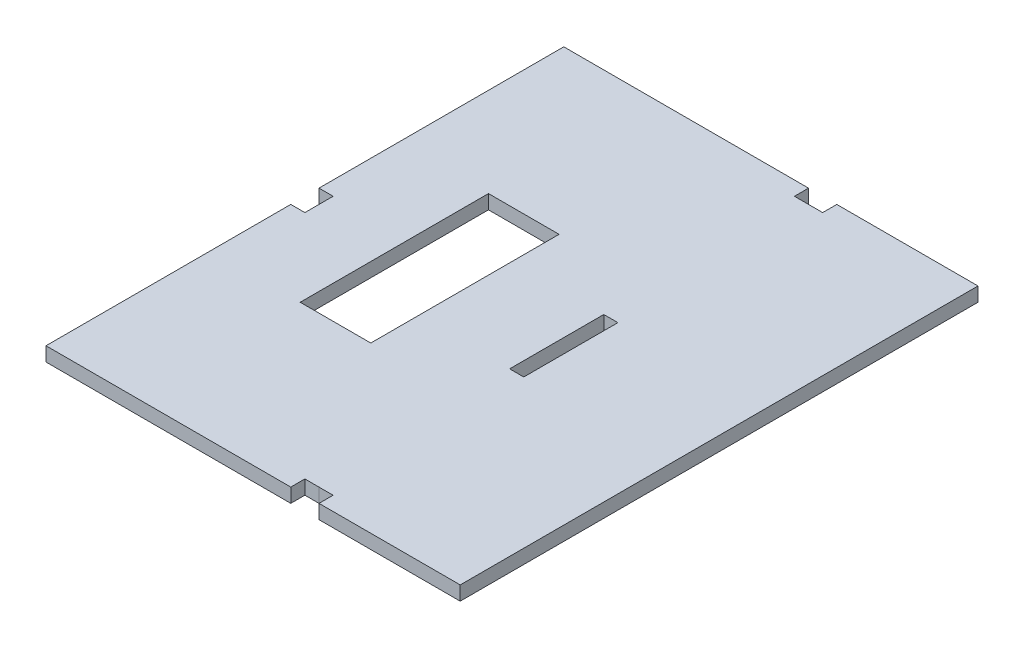
ISO-10303-21;
HEADER;
FILE_DESCRIPTION(('STEP AP214'),'2;1');
FILE_NAME('part.step','',(''),(''),'','','');
FILE_SCHEMA(('AUTOMOTIVE_DESIGN { 1 0 10303 214 1 1 1 1 }'));
ENDSEC;
DATA;
#1=APPLICATION_CONTEXT('core data for automotive mechanical design processes');
#2=APPLICATION_PROTOCOL_DEFINITION('international standard','automotive_design',2000,#1);
#3=PRODUCT_CONTEXT('',#1,'mechanical');
#4=PRODUCT('Part','Part','',(#3));
#5=PRODUCT_RELATED_PRODUCT_CATEGORY('part','',(#4));
#6=PRODUCT_DEFINITION_FORMATION('','',#4);
#7=PRODUCT_DEFINITION_CONTEXT('part definition',#1,'design');
#8=PRODUCT_DEFINITION('design','',#6,#7);
#9=PRODUCT_DEFINITION_SHAPE('','',#8);
#10=(LENGTH_UNIT() NAMED_UNIT(*) SI_UNIT(.MILLI.,.METRE.));
#11=(NAMED_UNIT(*) PLANE_ANGLE_UNIT() SI_UNIT($,.RADIAN.));
#12=(NAMED_UNIT(*) SI_UNIT($,.STERADIAN.) SOLID_ANGLE_UNIT());
#13=UNCERTAINTY_MEASURE_WITH_UNIT(LENGTH_MEASURE(1.E-05),#10,'distance_accuracy_value','');
#14=(GEOMETRIC_REPRESENTATION_CONTEXT(3) GLOBAL_UNCERTAINTY_ASSIGNED_CONTEXT((#13)) GLOBAL_UNIT_ASSIGNED_CONTEXT((#10,
#11,#12)) REPRESENTATION_CONTEXT('',''));
#15=CARTESIAN_POINT('',(0.,0.,0.));
#16=DIRECTION('',(0.,0.,1.));
#17=DIRECTION('',(1.,0.,0.));
#18=AXIS2_PLACEMENT_3D('',#15,#16,#17);
#19=CARTESIAN_POINT('',(0.,3.,-110.));
#20=DIRECTION('',(0.,0.,-1.));
#21=DIRECTION('',(-1.,0.,0.));
#22=AXIS2_PLACEMENT_3D('',#19,#20,#21);
#23=PLANE('',#22);
#24=DIRECTION('',(1.,0.,0.));
#25=VECTOR('',#24,1.);
#26=CARTESIAN_POINT('',(0.,0.,-110.));
#27=LINE('',#26,#25);
#28=CARTESIAN_POINT('',(58.,0.,-110.));
#29=VERTEX_POINT('',#28);
#30=CARTESIAN_POINT('',(88.,0.,-110.));
#31=VERTEX_POINT('',#30);
#32=EDGE_CURVE('E238',#29,#31,#27,.T.);
#33=ORIENTED_EDGE('',*,*,#32,.F.);
#34=DIRECTION('',(0.,-1.,0.));
#35=VECTOR('',#34,1.);
#36=CARTESIAN_POINT('',(58.,3.,-110.));
#37=LINE('',#36,#35);
#38=CARTESIAN_POINT('',(58.,3.,-110.));
#39=VERTEX_POINT('',#38);
#40=EDGE_CURVE('E386',#39,#29,#37,.T.);
#41=ORIENTED_EDGE('',*,*,#40,.F.);
#42=DIRECTION('',(1.,0.,0.));
#43=VECTOR('',#42,1.);
#44=CARTESIAN_POINT('',(0.,3.,-110.));
#45=LINE('',#44,#43);
#46=CARTESIAN_POINT('',(88.,3.,-110.));
#47=VERTEX_POINT('',#46);
#48=EDGE_CURVE('E259',#39,#47,#45,.T.);
#49=ORIENTED_EDGE('',*,*,#48,.T.);
#50=DIRECTION('',(0.,-1.,0.));
#51=VECTOR('',#50,1.);
#52=CARTESIAN_POINT('',(88.,3.,-110.));
#53=LINE('',#52,#51);
#54=EDGE_CURVE('E305',#47,#31,#53,.T.);
#55=ORIENTED_EDGE('',*,*,#54,.T.);
#56=EDGE_LOOP('',(#33,#41,#49,#55));
#57=FACE_BOUND('',#56,.T.);
#58=ADVANCED_FACE('F41',(#57),#23,.T.);
#59=CARTESIAN_POINT('',(58.,3.,0.));
#60=DIRECTION('',(-1.,0.,0.));
#61=DIRECTION('',(0.,0.,1.));
#62=AXIS2_PLACEMENT_3D('',#59,#60,#61);
#63=PLANE('',#62);
#64=DIRECTION('',(0.,0.,-1.));
#65=VECTOR('',#64,1.);
#66=CARTESIAN_POINT('',(58.,0.,0.));
#67=LINE('',#66,#65);
#68=CARTESIAN_POINT('',(58.,0.,-107.));
#69=VERTEX_POINT('',#68);
#70=EDGE_CURVE('E308',#69,#29,#67,.T.);
#71=ORIENTED_EDGE('',*,*,#70,.F.);
#72=DIRECTION('',(0.,-1.,0.));
#73=VECTOR('',#72,1.);
#74=CARTESIAN_POINT('',(58.,3.,-107.));
#75=LINE('',#74,#73);
#76=CARTESIAN_POINT('',(58.,3.,-107.));
#77=VERTEX_POINT('',#76);
#78=EDGE_CURVE('E384',#77,#69,#75,.T.);
#79=ORIENTED_EDGE('',*,*,#78,.F.);
#80=DIRECTION('',(0.,0.,-1.));
#81=VECTOR('',#80,1.);
#82=CARTESIAN_POINT('',(58.,3.,0.));
#83=LINE('',#82,#81);
#84=EDGE_CURVE('E262',#77,#39,#83,.T.);
#85=ORIENTED_EDGE('',*,*,#84,.T.);
#86=ORIENTED_EDGE('',*,*,#40,.T.);
#87=EDGE_LOOP('',(#71,#79,#85,#86));
#88=FACE_BOUND('',#87,.T.);
#89=ADVANCED_FACE('F424',(#88),#63,.T.);
#90=CARTESIAN_POINT('',(0.,3.,-107.));
#91=DIRECTION('',(0.,0.,-1.));
#92=DIRECTION('',(-1.,0.,0.));
#93=AXIS2_PLACEMENT_3D('',#90,#91,#92);
#94=PLANE('',#93);
#95=DIRECTION('',(1.,0.,0.));
#96=VECTOR('',#95,1.);
#97=CARTESIAN_POINT('',(0.,0.,-107.));
#98=LINE('',#97,#96);
#99=CARTESIAN_POINT('',(52.,0.,-107.));
#100=VERTEX_POINT('',#99);
#101=EDGE_CURVE('E311',#100,#69,#98,.T.);
#102=ORIENTED_EDGE('',*,*,#101,.F.);
#103=DIRECTION('',(0.,-1.,0.));
#104=VECTOR('',#103,1.);
#105=CARTESIAN_POINT('',(52.,3.,-107.));
#106=LINE('',#105,#104);
#107=CARTESIAN_POINT('',(52.,3.,-107.));
#108=VERTEX_POINT('',#107);
#109=EDGE_CURVE('E382',#108,#100,#106,.T.);
#110=ORIENTED_EDGE('',*,*,#109,.F.);
#111=DIRECTION('',(1.,0.,0.));
#112=VECTOR('',#111,1.);
#113=CARTESIAN_POINT('',(0.,3.,-107.));
#114=LINE('',#113,#112);
#115=EDGE_CURVE('E266',#108,#77,#114,.T.);
#116=ORIENTED_EDGE('',*,*,#115,.T.);
#117=ORIENTED_EDGE('',*,*,#78,.T.);
#118=EDGE_LOOP('',(#102,#110,#116,#117));
#119=FACE_BOUND('',#118,.T.);
#120=ADVANCED_FACE('F429',(#119),#94,.T.);
#121=CARTESIAN_POINT('',(52.,3.,0.));
#122=DIRECTION('',(-1.,0.,0.));
#123=DIRECTION('',(0.,0.,1.));
#124=AXIS2_PLACEMENT_3D('',#121,#122,#123);
#125=PLANE('',#124);
#126=DIRECTION('',(0.,0.,-1.));
#127=VECTOR('',#126,1.);
#128=CARTESIAN_POINT('',(52.,0.,0.));
#129=LINE('',#128,#127);
#130=CARTESIAN_POINT('',(52.,0.,-110.));
#131=VERTEX_POINT('',#130);
#132=EDGE_CURVE('E314',#100,#131,#129,.T.);
#133=ORIENTED_EDGE('',*,*,#132,.T.);
#134=DIRECTION('',(0.,-1.,0.));
#135=VECTOR('',#134,1.);
#136=CARTESIAN_POINT('',(52.,3.,-110.));
#137=LINE('',#136,#135);
#138=CARTESIAN_POINT('',(52.,3.,-110.));
#139=VERTEX_POINT('',#138);
#140=EDGE_CURVE('E380',#139,#131,#137,.T.);
#141=ORIENTED_EDGE('',*,*,#140,.F.);
#142=DIRECTION('',(0.,0.,-1.));
#143=VECTOR('',#142,1.);
#144=CARTESIAN_POINT('',(52.,3.,0.));
#145=LINE('',#144,#143);
#146=EDGE_CURVE('E269',#108,#139,#145,.T.);
#147=ORIENTED_EDGE('',*,*,#146,.F.);
#148=ORIENTED_EDGE('',*,*,#109,.T.);
#149=EDGE_LOOP('',(#133,#141,#147,#148));
#150=FACE_BOUND('',#149,.T.);
#151=ADVANCED_FACE('F446',(#150),#125,.F.);
#152=CARTESIAN_POINT('',(0.,3.,-110.));
#153=DIRECTION('',(0.,0.,-1.));
#154=DIRECTION('',(-1.,0.,0.));
#155=AXIS2_PLACEMENT_3D('',#152,#153,#154);
#156=PLANE('',#155);
#157=DIRECTION('',(1.,0.,0.));
#158=VECTOR('',#157,1.);
#159=CARTESIAN_POINT('',(0.,0.,-110.));
#160=LINE('',#159,#158);
#161=CARTESIAN_POINT('',(0.,0.,-110.));
#162=VERTEX_POINT('',#161);
#163=EDGE_CURVE('E317',#162,#131,#160,.T.);
#164=ORIENTED_EDGE('',*,*,#163,.F.);
#165=DIRECTION('',(0.,-1.,0.));
#166=VECTOR('',#165,1.);
#167=CARTESIAN_POINT('',(0.,3.,-110.));
#168=LINE('',#167,#166);
#169=CARTESIAN_POINT('',(0.,3.,-110.));
#170=VERTEX_POINT('',#169);
#171=EDGE_CURVE('E378',#170,#162,#168,.T.);
#172=ORIENTED_EDGE('',*,*,#171,.F.);
#173=DIRECTION('',(1.,0.,0.));
#174=VECTOR('',#173,1.);
#175=CARTESIAN_POINT('',(0.,3.,-110.));
#176=LINE('',#175,#174);
#177=EDGE_CURVE('E271',#170,#139,#176,.T.);
#178=ORIENTED_EDGE('',*,*,#177,.T.);
#179=ORIENTED_EDGE('',*,*,#140,.T.);
#180=EDGE_LOOP('',(#164,#172,#178,#179));
#181=FACE_BOUND('',#180,.T.);
#182=ADVANCED_FACE('F501',(#181),#156,.T.);
#183=CARTESIAN_POINT('',(0.,3.,0.));
#184=DIRECTION('',(-1.,0.,0.));
#185=DIRECTION('',(0.,0.,1.));
#186=AXIS2_PLACEMENT_3D('',#183,#184,#185);
#187=PLANE('',#186);
#188=DIRECTION('',(0.,0.,-1.));
#189=VECTOR('',#188,1.);
#190=CARTESIAN_POINT('',(0.,0.,0.));
#191=LINE('',#190,#189);
#192=CARTESIAN_POINT('',(0.,0.,-58.));
#193=VERTEX_POINT('',#192);
#194=EDGE_CURVE('E320',#193,#162,#191,.T.);
#195=ORIENTED_EDGE('',*,*,#194,.F.);
#196=DIRECTION('',(0.,-1.,0.));
#197=VECTOR('',#196,1.);
#198=CARTESIAN_POINT('',(0.,3.,-58.));
#199=LINE('',#198,#197);
#200=CARTESIAN_POINT('',(0.,3.,-58.));
#201=VERTEX_POINT('',#200);
#202=EDGE_CURVE('E376',#201,#193,#199,.T.);
#203=ORIENTED_EDGE('',*,*,#202,.F.);
#204=DIRECTION('',(0.,0.,-1.));
#205=VECTOR('',#204,1.);
#206=CARTESIAN_POINT('',(0.,3.,0.));
#207=LINE('',#206,#205);
#208=EDGE_CURVE('E274',#201,#170,#207,.T.);
#209=ORIENTED_EDGE('',*,*,#208,.T.);
#210=ORIENTED_EDGE('',*,*,#171,.T.);
#211=EDGE_LOOP('',(#195,#203,#209,#210));
#212=FACE_BOUND('',#211,.T.);
#213=ADVANCED_FACE('F453',(#212),#187,.T.);
#214=CARTESIAN_POINT('',(0.,3.,-58.));
#215=DIRECTION('',(0.,0.,1.));
#216=DIRECTION('',(1.,0.,0.));
#217=AXIS2_PLACEMENT_3D('',#214,#215,#216);
#218=PLANE('',#217);
#219=DIRECTION('',(-1.,0.,0.));
#220=VECTOR('',#219,1.);
#221=CARTESIAN_POINT('',(0.,0.,-58.));
#222=LINE('',#221,#220);
#223=CARTESIAN_POINT('',(3.,0.,-58.));
#224=VERTEX_POINT('',#223);
#225=EDGE_CURVE('E323',#224,#193,#222,.T.);
#226=ORIENTED_EDGE('',*,*,#225,.F.);
#227=DIRECTION('',(0.,-1.,0.));
#228=VECTOR('',#227,1.);
#229=CARTESIAN_POINT('',(3.,3.,-58.));
#230=LINE('',#229,#228);
#231=CARTESIAN_POINT('',(3.,3.,-58.));
#232=VERTEX_POINT('',#231);
#233=EDGE_CURVE('E374',#232,#224,#230,.T.);
#234=ORIENTED_EDGE('',*,*,#233,.F.);
#235=DIRECTION('',(-1.,0.,0.));
#236=VECTOR('',#235,1.);
#237=CARTESIAN_POINT('',(0.,3.,-58.));
#238=LINE('',#237,#236);
#239=EDGE_CURVE('E277',#232,#201,#238,.T.);
#240=ORIENTED_EDGE('',*,*,#239,.T.);
#241=ORIENTED_EDGE('',*,*,#202,.T.);
#242=EDGE_LOOP('',(#226,#234,#240,#241));
#243=FACE_BOUND('',#242,.T.);
#244=ADVANCED_FACE('F457',(#243),#218,.T.);
#245=CARTESIAN_POINT('',(3.,3.,0.));
#246=DIRECTION('',(-1.,0.,0.));
#247=DIRECTION('',(0.,0.,1.));
#248=AXIS2_PLACEMENT_3D('',#245,#246,#247);
#249=PLANE('',#248);
#250=DIRECTION('',(0.,0.,-1.));
#251=VECTOR('',#250,1.);
#252=CARTESIAN_POINT('',(3.,0.,0.));
#253=LINE('',#252,#251);
#254=CARTESIAN_POINT('',(3.,0.,-52.));
#255=VERTEX_POINT('',#254);
#256=EDGE_CURVE('E326',#255,#224,#253,.T.);
#257=ORIENTED_EDGE('',*,*,#256,.F.);
#258=DIRECTION('',(0.,-1.,0.));
#259=VECTOR('',#258,1.);
#260=CARTESIAN_POINT('',(3.,3.,-52.));
#261=LINE('',#260,#259);
#262=CARTESIAN_POINT('',(3.,3.,-52.));
#263=VERTEX_POINT('',#262);
#264=EDGE_CURVE('E372',#263,#255,#261,.T.);
#265=ORIENTED_EDGE('',*,*,#264,.F.);
#266=DIRECTION('',(0.,0.,-1.));
#267=VECTOR('',#266,1.);
#268=CARTESIAN_POINT('',(3.,3.,0.));
#269=LINE('',#268,#267);
#270=EDGE_CURVE('E280',#263,#232,#269,.T.);
#271=ORIENTED_EDGE('',*,*,#270,.T.);
#272=ORIENTED_EDGE('',*,*,#233,.T.);
#273=EDGE_LOOP('',(#257,#265,#271,#272));
#274=FACE_BOUND('',#273,.T.);
#275=ADVANCED_FACE('F461',(#274),#249,.T.);
#276=CARTESIAN_POINT('',(0.,3.,-52.));
#277=DIRECTION('',(0.,0.,1.));
#278=DIRECTION('',(1.,0.,0.));
#279=AXIS2_PLACEMENT_3D('',#276,#277,#278);
#280=PLANE('',#279);
#281=DIRECTION('',(-1.,0.,0.));
#282=VECTOR('',#281,1.);
#283=CARTESIAN_POINT('',(0.,0.,-52.));
#284=LINE('',#283,#282);
#285=CARTESIAN_POINT('',(0.,0.,-52.));
#286=VERTEX_POINT('',#285);
#287=EDGE_CURVE('E329',#255,#286,#284,.T.);
#288=ORIENTED_EDGE('',*,*,#287,.T.);
#289=DIRECTION('',(0.,-1.,0.));
#290=VECTOR('',#289,1.);
#291=CARTESIAN_POINT('',(0.,3.,-52.));
#292=LINE('',#291,#290);
#293=CARTESIAN_POINT('',(0.,3.,-52.));
#294=VERTEX_POINT('',#293);
#295=EDGE_CURVE('E370',#294,#286,#292,.T.);
#296=ORIENTED_EDGE('',*,*,#295,.F.);
#297=DIRECTION('',(-1.,0.,0.));
#298=VECTOR('',#297,1.);
#299=CARTESIAN_POINT('',(0.,3.,-52.));
#300=LINE('',#299,#298);
#301=EDGE_CURVE('E283',#263,#294,#300,.T.);
#302=ORIENTED_EDGE('',*,*,#301,.F.);
#303=ORIENTED_EDGE('',*,*,#264,.T.);
#304=EDGE_LOOP('',(#288,#296,#302,#303));
#305=FACE_BOUND('',#304,.T.);
#306=ADVANCED_FACE('F466',(#305),#280,.F.);
#307=CARTESIAN_POINT('',(0.,3.,0.));
#308=DIRECTION('',(-1.,0.,0.));
#309=DIRECTION('',(0.,0.,1.));
#310=AXIS2_PLACEMENT_3D('',#307,#308,#309);
#311=PLANE('',#310);
#312=DIRECTION('',(0.,0.,-1.));
#313=VECTOR('',#312,1.);
#314=CARTESIAN_POINT('',(0.,0.,0.));
#315=LINE('',#314,#313);
#316=CARTESIAN_POINT('',(0.,0.,0.));
#317=VERTEX_POINT('',#316);
#318=EDGE_CURVE('E332',#317,#286,#315,.T.);
#319=ORIENTED_EDGE('',*,*,#318,.F.);
#320=DIRECTION('',(0.,-1.,0.));
#321=VECTOR('',#320,1.);
#322=CARTESIAN_POINT('',(0.,3.,0.));
#323=LINE('',#322,#321);
#324=CARTESIAN_POINT('',(0.,3.,0.));
#325=VERTEX_POINT('',#324);
#326=EDGE_CURVE('E368',#325,#317,#323,.T.);
#327=ORIENTED_EDGE('',*,*,#326,.F.);
#328=DIRECTION('',(0.,0.,-1.));
#329=VECTOR('',#328,1.);
#330=CARTESIAN_POINT('',(0.,3.,0.));
#331=LINE('',#330,#329);
#332=EDGE_CURVE('E285',#325,#294,#331,.T.);
#333=ORIENTED_EDGE('',*,*,#332,.T.);
#334=ORIENTED_EDGE('',*,*,#295,.T.);
#335=EDGE_LOOP('',(#319,#327,#333,#334));
#336=FACE_BOUND('',#335,.T.);
#337=ADVANCED_FACE('F473',(#336),#311,.T.);
#338=CARTESIAN_POINT('',(0.,3.,0.));
#339=DIRECTION('',(0.,0.,-1.));
#340=DIRECTION('',(-1.,0.,0.));
#341=AXIS2_PLACEMENT_3D('',#338,#339,#340);
#342=PLANE('',#341);
#343=DIRECTION('',(1.,0.,0.));
#344=VECTOR('',#343,1.);
#345=CARTESIAN_POINT('',(0.,0.,0.));
#346=LINE('',#345,#344);
#347=CARTESIAN_POINT('',(52.,0.,0.));
#348=VERTEX_POINT('',#347);
#349=EDGE_CURVE('E335',#317,#348,#346,.T.);
#350=ORIENTED_EDGE('',*,*,#349,.T.);
#351=DIRECTION('',(0.,-1.,0.));
#352=VECTOR('',#351,1.);
#353=CARTESIAN_POINT('',(52.,3.,0.));
#354=LINE('',#353,#352);
#355=CARTESIAN_POINT('',(52.,3.,0.));
#356=VERTEX_POINT('',#355);
#357=EDGE_CURVE('E366',#356,#348,#354,.T.);
#358=ORIENTED_EDGE('',*,*,#357,.F.);
#359=DIRECTION('',(1.,0.,0.));
#360=VECTOR('',#359,1.);
#361=CARTESIAN_POINT('',(0.,3.,0.));
#362=LINE('',#361,#360);
#363=EDGE_CURVE('E288',#325,#356,#362,.T.);
#364=ORIENTED_EDGE('',*,*,#363,.F.);
#365=ORIENTED_EDGE('',*,*,#326,.T.);
#366=EDGE_LOOP('',(#350,#358,#364,#365));
#367=FACE_BOUND('',#366,.T.);
#368=ADVANCED_FACE('F476',(#367),#342,.F.);
#369=CARTESIAN_POINT('',(51.999999999185,3.,0.000205859931192576));
#370=DIRECTION('',(0.999999999992164,0.,3.95884483065748E-06));
#371=DIRECTION('',(3.95884483065748E-06,0.,-0.999999999992164));
#372=AXIS2_PLACEMENT_3D('',#369,#370,#371);
#373=PLANE('',#372);
#374=DIRECTION('',(-3.95884483065748E-06,0.,0.999999999992164));
#375=VECTOR('',#374,1.);
#376=CARTESIAN_POINT('',(51.999999999185,0.,0.000205859931192576));
#377=LINE('',#376,#375);
#378=CARTESIAN_POINT('',(52.0000118765345,0.,-2.99999999997649));
#379=VERTEX_POINT('',#378);
#380=EDGE_CURVE('E338',#379,#348,#377,.T.);
#381=ORIENTED_EDGE('',*,*,#380,.F.);
#382=DIRECTION('',(0.,-1.,0.));
#383=VECTOR('',#382,1.);
#384=CARTESIAN_POINT('',(52.0000118765345,3.,-2.99999999997649));
#385=LINE('',#384,#383);
#386=CARTESIAN_POINT('',(52.0000118765345,3.,-2.99999999997649));
#387=VERTEX_POINT('',#386);
#388=EDGE_CURVE('E364',#387,#379,#385,.T.);
#389=ORIENTED_EDGE('',*,*,#388,.F.);
#390=DIRECTION('',(-3.95884483065748E-06,0.,0.999999999992164));
#391=VECTOR('',#390,1.);
#392=CARTESIAN_POINT('',(51.999999999185,3.,0.000205859931192576));
#393=LINE('',#392,#391);
#394=EDGE_CURVE('E290',#387,#356,#393,.T.);
#395=ORIENTED_EDGE('',*,*,#394,.T.);
#396=ORIENTED_EDGE('',*,*,#357,.T.);
#397=EDGE_LOOP('',(#381,#389,#395,#396));
#398=FACE_BOUND('',#397,.T.);
#399=ADVANCED_FACE('F479',(#398),#373,.T.);
#400=CARTESIAN_POINT('',(0.00885319423630135,3.,-3.14629518201044));
#401=DIRECTION('',(-0.00281383617103022,0.,0.999996041155165));
#402=DIRECTION('',(0.999996041155165,0.,0.00281383617103022));
#403=AXIS2_PLACEMENT_3D('',#400,#401,#402);
#404=PLANE('',#403);
#405=DIRECTION('',(-0.999996041155165,0.,-0.00281383617103021));
#406=VECTOR('',#405,1.);
#407=CARTESIAN_POINT('',(0.00885319423630135,0.,-3.14629518201044));
#408=LINE('',#407,#406);
#409=CARTESIAN_POINT('',(55.,0.,-2.9915584914634));
#410=VERTEX_POINT('',#409);
#411=EDGE_CURVE('E341',#410,#379,#408,.T.);
#412=ORIENTED_EDGE('',*,*,#411,.F.);
#413=DIRECTION('',(0.,-1.,0.));
#414=VECTOR('',#413,1.);
#415=CARTESIAN_POINT('',(55.,3.,-2.9915584914634));
#416=LINE('',#415,#414);
#417=CARTESIAN_POINT('',(55.,3.,-2.9915584914634));
#418=VERTEX_POINT('',#417);
#419=EDGE_CURVE('E362',#418,#410,#416,.T.);
#420=ORIENTED_EDGE('',*,*,#419,.F.);
#421=DIRECTION('',(-0.999996041155165,0.,-0.00281383617103021));
#422=VECTOR('',#421,1.);
#423=CARTESIAN_POINT('',(0.00885319423630135,3.,-3.14629518201044));
#424=LINE('',#423,#422);
#425=EDGE_CURVE('E293',#418,#387,#424,.T.);
#426=ORIENTED_EDGE('',*,*,#425,.T.);
#427=ORIENTED_EDGE('',*,*,#388,.T.);
#428=EDGE_LOOP('',(#412,#420,#426,#427));
#429=FACE_BOUND('',#428,.T.);
#430=ADVANCED_FACE('F483',(#429),#404,.T.);
#431=CARTESIAN_POINT('',(-0.00798225009658836,3.,-2.83677442854659));
#432=DIRECTION('',(-0.00281383617103051,0.,-0.999996041155165));
#433=DIRECTION('',(-0.999996041155165,0.,0.00281383617103051));
#434=AXIS2_PLACEMENT_3D('',#431,#432,#433);
#435=PLANE('',#434);
#436=DIRECTION('',(0.999996041155165,0.,-0.00281383617103051));
#437=VECTOR('',#436,1.);
#438=CARTESIAN_POINT('',(-0.00798225009658836,0.,-2.83677442854659));
#439=LINE('',#438,#437);
#440=CARTESIAN_POINT('',(57.9999881234655,0.,-2.99999999997649));
#441=VERTEX_POINT('',#440);
#442=EDGE_CURVE('E344',#410,#441,#439,.T.);
#443=ORIENTED_EDGE('',*,*,#442,.T.);
#444=DIRECTION('',(0.,-1.,0.));
#445=VECTOR('',#444,1.);
#446=CARTESIAN_POINT('',(57.9999881234655,3.,-2.99999999997649));
#447=LINE('',#446,#445);
#448=CARTESIAN_POINT('',(57.9999881234655,3.,-2.99999999997649));
#449=VERTEX_POINT('',#448);
#450=EDGE_CURVE('E359',#449,#441,#447,.T.);
#451=ORIENTED_EDGE('',*,*,#450,.F.);
#452=DIRECTION('',(0.999996041155165,0.,-0.00281383617103051));
#453=VECTOR('',#452,1.);
#454=CARTESIAN_POINT('',(-0.00798225009658836,3.,-2.83677442854659));
#455=LINE('',#454,#453);
#456=EDGE_CURVE('E296',#418,#449,#455,.T.);
#457=ORIENTED_EDGE('',*,*,#456,.F.);
#458=ORIENTED_EDGE('',*,*,#419,.T.);
#459=EDGE_LOOP('',(#443,#451,#457,#458));
#460=FACE_BOUND('',#459,.T.);
#461=ADVANCED_FACE('F488',(#460),#435,.F.);
#462=CARTESIAN_POINT('',(57.999999999091,3.,-0.00022961300057879));
#463=DIRECTION('',(0.999999999992164,0.,-3.95884483759638E-06));
#464=DIRECTION('',(-3.95884483759638E-06,0.,-0.999999999992164));
#465=AXIS2_PLACEMENT_3D('',#462,#463,#464);
#466=PLANE('',#465);
#467=DIRECTION('',(3.95884483759638E-06,0.,0.999999999992164));
#468=VECTOR('',#467,1.);
#469=CARTESIAN_POINT('',(57.999999999091,0.,-0.00022961300057879));
#470=LINE('',#469,#468);
#471=CARTESIAN_POINT('',(58.,0.,0.));
#472=VERTEX_POINT('',#471);
#473=EDGE_CURVE('E346',#441,#472,#470,.T.);
#474=ORIENTED_EDGE('',*,*,#473,.T.);
#475=DIRECTION('',(0.,-1.,0.));
#476=VECTOR('',#475,1.);
#477=CARTESIAN_POINT('',(58.,3.,0.));
#478=LINE('',#477,#476);
#479=CARTESIAN_POINT('',(58.,3.,0.));
#480=VERTEX_POINT('',#479);
#481=EDGE_CURVE('E356',#480,#472,#478,.T.);
#482=ORIENTED_EDGE('',*,*,#481,.F.);
#483=DIRECTION('',(3.95884483759638E-06,0.,0.999999999992164));
#484=VECTOR('',#483,1.);
#485=CARTESIAN_POINT('',(57.999999999091,3.,-0.00022961300057879));
#486=LINE('',#485,#484);
#487=EDGE_CURVE('E298',#449,#480,#486,.T.);
#488=ORIENTED_EDGE('',*,*,#487,.F.);
#489=ORIENTED_EDGE('',*,*,#450,.T.);
#490=EDGE_LOOP('',(#474,#482,#488,#489));
#491=FACE_BOUND('',#490,.T.);
#492=ADVANCED_FACE('F494',(#491),#466,.F.);
#493=CARTESIAN_POINT('',(0.,3.,0.));
#494=DIRECTION('',(0.,0.,-1.));
#495=DIRECTION('',(-1.,0.,0.));
#496=AXIS2_PLACEMENT_3D('',#493,#494,#495);
#497=PLANE('',#496);
#498=DIRECTION('',(1.,0.,0.));
#499=VECTOR('',#498,1.);
#500=CARTESIAN_POINT('',(0.,0.,0.));
#501=LINE('',#500,#499);
#502=CARTESIAN_POINT('',(88.,0.,0.));
#503=VERTEX_POINT('',#502);
#504=EDGE_CURVE('E348',#472,#503,#501,.T.);
#505=ORIENTED_EDGE('',*,*,#504,.T.);
#506=DIRECTION('',(0.,-1.,0.));
#507=VECTOR('',#506,1.);
#508=CARTESIAN_POINT('',(88.,3.,0.));
#509=LINE('',#508,#507);
#510=CARTESIAN_POINT('',(88.,3.,0.));
#511=VERTEX_POINT('',#510);
#512=EDGE_CURVE('E354',#511,#503,#509,.T.);
#513=ORIENTED_EDGE('',*,*,#512,.F.);
#514=DIRECTION('',(1.,0.,0.));
#515=VECTOR('',#514,1.);
#516=CARTESIAN_POINT('',(0.,3.,0.));
#517=LINE('',#516,#515);
#518=EDGE_CURVE('E300',#480,#511,#517,.T.);
#519=ORIENTED_EDGE('',*,*,#518,.F.);
#520=ORIENTED_EDGE('',*,*,#481,.T.);
#521=EDGE_LOOP('',(#505,#513,#519,#520));
#522=FACE_BOUND('',#521,.T.);
#523=ADVANCED_FACE('F498',(#522),#497,.F.);
#524=CARTESIAN_POINT('',(88.,3.,0.));
#525=DIRECTION('',(1.,0.,0.));
#526=DIRECTION('',(0.,0.,-1.));
#527=AXIS2_PLACEMENT_3D('',#524,#525,#526);
#528=PLANE('',#527);
#529=DIRECTION('',(0.,0.,1.));
#530=VECTOR('',#529,1.);
#531=CARTESIAN_POINT('',(88.,0.,0.));
#532=LINE('',#531,#530);
#533=EDGE_CURVE('E263',#31,#503,#532,.T.);
#534=ORIENTED_EDGE('',*,*,#533,.F.);
#535=ORIENTED_EDGE('',*,*,#54,.F.);
#536=DIRECTION('',(0.,0.,1.));
#537=VECTOR('',#536,1.);
#538=CARTESIAN_POINT('',(88.,3.,0.));
#539=LINE('',#538,#537);
#540=EDGE_CURVE('E302',#47,#511,#539,.T.);
#541=ORIENTED_EDGE('',*,*,#540,.T.);
#542=ORIENTED_EDGE('',*,*,#512,.T.);
#543=EDGE_LOOP('',(#534,#535,#541,#542));
#544=FACE_BOUND('',#543,.T.);
#545=ADVANCED_FACE('F500',(#544),#528,.T.);
#546=CARTESIAN_POINT('',(0.,3.,0.));
#547=DIRECTION('',(0.,1.,0.));
#548=DIRECTION('',(0.,0.,1.));
#549=AXIS2_PLACEMENT_3D('',#546,#547,#548);
#550=PLANE('',#549);
#551=DIRECTION('',(0.,0.,1.));
#552=VECTOR('',#551,1.);
#553=CARTESIAN_POINT('',(19.,3.,-75.));
#554=LINE('',#553,#552);
#555=CARTESIAN_POINT('',(19.,3.,-75.));
#556=VERTEX_POINT('',#555);
#557=CARTESIAN_POINT('',(19.,3.,-35.));
#558=VERTEX_POINT('',#557);
#559=EDGE_CURVE('E55',#556,#558,#554,.T.);
#560=ORIENTED_EDGE('',*,*,#559,.F.);
#561=DIRECTION('',(-1.,0.,0.));
#562=VECTOR('',#561,1.);
#563=CARTESIAN_POINT('',(19.,3.,-75.));
#564=LINE('',#563,#562);
#565=CARTESIAN_POINT('',(34.,3.,-75.0000000000001));
#566=VERTEX_POINT('',#565);
#567=EDGE_CURVE('E231',#566,#556,#564,.T.);
#568=ORIENTED_EDGE('',*,*,#567,.F.);
#569=DIRECTION('',(0.,0.,-1.));
#570=VECTOR('',#569,1.);
#571=CARTESIAN_POINT('',(34.,3.,-75.0000000000001));
#572=LINE('',#571,#570);
#573=CARTESIAN_POINT('',(34.,3.,-35.));
#574=VERTEX_POINT('',#573);
#575=EDGE_CURVE('E214',#574,#566,#572,.T.);
#576=ORIENTED_EDGE('',*,*,#575,.F.);
#577=DIRECTION('',(1.,0.,0.));
#578=VECTOR('',#577,1.);
#579=CARTESIAN_POINT('',(19.,3.,-35.));
#580=LINE('',#579,#578);
#581=EDGE_CURVE('E224',#558,#574,#580,.T.);
#582=ORIENTED_EDGE('',*,*,#581,.F.);
#583=EDGE_LOOP('',(#560,#568,#576,#582));
#584=FACE_BOUND('',#583,.T.);
#585=DIRECTION('',(0.,0.,1.));
#586=VECTOR('',#585,1.);
#587=CARTESIAN_POINT('',(53.5,3.,-65.));
#588=LINE('',#587,#586);
#589=CARTESIAN_POINT('',(53.5,3.,-65.));
#590=VERTEX_POINT('',#589);
#591=CARTESIAN_POINT('',(53.5,3.,-45.));
#592=VERTEX_POINT('',#591);
#593=EDGE_CURVE('E63',#590,#592,#588,.T.);
#594=ORIENTED_EDGE('',*,*,#593,.F.);
#595=DIRECTION('',(-1.,0.,0.));
#596=VECTOR('',#595,1.);
#597=CARTESIAN_POINT('',(53.5,3.,-65.));
#598=LINE('',#597,#596);
#599=CARTESIAN_POINT('',(56.5,3.,-65.));
#600=VERTEX_POINT('',#599);
#601=EDGE_CURVE('E243',#600,#590,#598,.T.);
#602=ORIENTED_EDGE('',*,*,#601,.F.);
#603=DIRECTION('',(0.,0.,-1.));
#604=VECTOR('',#603,1.);
#605=CARTESIAN_POINT('',(56.5,3.,-65.));
#606=LINE('',#605,#604);
#607=CARTESIAN_POINT('',(56.5,3.,-45.));
#608=VERTEX_POINT('',#607);
#609=EDGE_CURVE('E252',#608,#600,#606,.T.);
#610=ORIENTED_EDGE('',*,*,#609,.F.);
#611=DIRECTION('',(1.,0.,0.));
#612=VECTOR('',#611,1.);
#613=CARTESIAN_POINT('',(53.5,3.,-45.));
#614=LINE('',#613,#612);
#615=EDGE_CURVE('E255',#592,#608,#614,.T.);
#616=ORIENTED_EDGE('',*,*,#615,.F.);
#617=EDGE_LOOP('',(#594,#602,#610,#616));
#618=FACE_BOUND('',#617,.T.);
#619=ORIENTED_EDGE('',*,*,#48,.F.);
#620=ORIENTED_EDGE('',*,*,#84,.F.);
#621=ORIENTED_EDGE('',*,*,#115,.F.);
#622=ORIENTED_EDGE('',*,*,#146,.T.);
#623=ORIENTED_EDGE('',*,*,#177,.F.);
#624=ORIENTED_EDGE('',*,*,#208,.F.);
#625=ORIENTED_EDGE('',*,*,#239,.F.);
#626=ORIENTED_EDGE('',*,*,#270,.F.);
#627=ORIENTED_EDGE('',*,*,#301,.T.);
#628=ORIENTED_EDGE('',*,*,#332,.F.);
#629=ORIENTED_EDGE('',*,*,#363,.T.);
#630=ORIENTED_EDGE('',*,*,#394,.F.);
#631=ORIENTED_EDGE('',*,*,#425,.F.);
#632=ORIENTED_EDGE('',*,*,#456,.T.);
#633=ORIENTED_EDGE('',*,*,#487,.T.);
#634=ORIENTED_EDGE('',*,*,#518,.T.);
#635=ORIENTED_EDGE('',*,*,#540,.F.);
#636=EDGE_LOOP('',(#619,#620,#621,#622,#623,#624,#625,#626,#627,#628,#629,#630,#631,#632,#633,
#634,#635));
#637=FACE_BOUND('',#636,.T.);
#638=ADVANCED_FACE('F228',(#584,#618,#637),#550,.T.);
#639=CARTESIAN_POINT('',(0.,0.,0.));
#640=DIRECTION('',(0.,1.,0.));
#641=DIRECTION('',(0.,0.,1.));
#642=AXIS2_PLACEMENT_3D('',#639,#640,#641);
#643=PLANE('',#642);
#644=DIRECTION('',(-1.,0.,0.));
#645=VECTOR('',#644,1.);
#646=CARTESIAN_POINT('',(0.,0.,-75.));
#647=LINE('',#646,#645);
#648=CARTESIAN_POINT('',(34.,0.,-75.0000000000001));
#649=VERTEX_POINT('',#648);
#650=CARTESIAN_POINT('',(19.,0.,-75.));
#651=VERTEX_POINT('',#650);
#652=EDGE_CURVE('E48',#649,#651,#647,.T.);
#653=ORIENTED_EDGE('',*,*,#652,.T.);
#654=DIRECTION('',(0.,0.,1.));
#655=VECTOR('',#654,1.);
#656=CARTESIAN_POINT('',(19.,0.,0.));
#657=LINE('',#656,#655);
#658=CARTESIAN_POINT('',(19.,0.,-35.));
#659=VERTEX_POINT('',#658);
#660=EDGE_CURVE('E11',#651,#659,#657,.T.);
#661=ORIENTED_EDGE('',*,*,#660,.T.);
#662=DIRECTION('',(1.,0.,0.));
#663=VECTOR('',#662,1.);
#664=CARTESIAN_POINT('',(0.,0.,-35.));
#665=LINE('',#664,#663);
#666=CARTESIAN_POINT('',(34.,0.,-35.));
#667=VERTEX_POINT('',#666);
#668=EDGE_CURVE('E400',#659,#667,#665,.T.);
#669=ORIENTED_EDGE('',*,*,#668,.T.);
#670=DIRECTION('',(0.,0.,-1.));
#671=VECTOR('',#670,1.);
#672=CARTESIAN_POINT('',(34.,0.,0.));
#673=LINE('',#672,#671);
#674=EDGE_CURVE('E217',#667,#649,#673,.T.);
#675=ORIENTED_EDGE('',*,*,#674,.T.);
#676=EDGE_LOOP('',(#653,#661,#669,#675));
#677=FACE_BOUND('',#676,.T.);
#678=DIRECTION('',(-1.,0.,0.));
#679=VECTOR('',#678,1.);
#680=CARTESIAN_POINT('',(0.,0.,-65.));
#681=LINE('',#680,#679);
#682=CARTESIAN_POINT('',(56.5,0.,-65.));
#683=VERTEX_POINT('',#682);
#684=CARTESIAN_POINT('',(53.5,0.,-65.));
#685=VERTEX_POINT('',#684);
#686=EDGE_CURVE('E394',#683,#685,#681,.T.);
#687=ORIENTED_EDGE('',*,*,#686,.T.);
#688=DIRECTION('',(0.,0.,1.));
#689=VECTOR('',#688,1.);
#690=CARTESIAN_POINT('',(53.5,0.,0.));
#691=LINE('',#690,#689);
#692=CARTESIAN_POINT('',(53.5,0.,-45.));
#693=VERTEX_POINT('',#692);
#694=EDGE_CURVE('E397',#685,#693,#691,.T.);
#695=ORIENTED_EDGE('',*,*,#694,.T.);
#696=DIRECTION('',(1.,0.,0.));
#697=VECTOR('',#696,1.);
#698=CARTESIAN_POINT('',(0.,0.,-45.));
#699=LINE('',#698,#697);
#700=CARTESIAN_POINT('',(56.5,0.,-45.));
#701=VERTEX_POINT('',#700);
#702=EDGE_CURVE('E388',#693,#701,#699,.T.);
#703=ORIENTED_EDGE('',*,*,#702,.T.);
#704=DIRECTION('',(0.,0.,-1.));
#705=VECTOR('',#704,1.);
#706=CARTESIAN_POINT('',(56.5,0.,0.));
#707=LINE('',#706,#705);
#708=EDGE_CURVE('E391',#701,#683,#707,.T.);
#709=ORIENTED_EDGE('',*,*,#708,.T.);
#710=EDGE_LOOP('',(#687,#695,#703,#709));
#711=FACE_BOUND('',#710,.T.);
#712=ORIENTED_EDGE('',*,*,#32,.T.);
#713=ORIENTED_EDGE('',*,*,#533,.T.);
#714=ORIENTED_EDGE('',*,*,#504,.F.);
#715=ORIENTED_EDGE('',*,*,#473,.F.);
#716=ORIENTED_EDGE('',*,*,#442,.F.);
#717=ORIENTED_EDGE('',*,*,#411,.T.);
#718=ORIENTED_EDGE('',*,*,#380,.T.);
#719=ORIENTED_EDGE('',*,*,#349,.F.);
#720=ORIENTED_EDGE('',*,*,#318,.T.);
#721=ORIENTED_EDGE('',*,*,#287,.F.);
#722=ORIENTED_EDGE('',*,*,#256,.T.);
#723=ORIENTED_EDGE('',*,*,#225,.T.);
#724=ORIENTED_EDGE('',*,*,#194,.T.);
#725=ORIENTED_EDGE('',*,*,#163,.T.);
#726=ORIENTED_EDGE('',*,*,#132,.F.);
#727=ORIENTED_EDGE('',*,*,#101,.T.);
#728=ORIENTED_EDGE('',*,*,#70,.T.);
#729=EDGE_LOOP('',(#712,#713,#714,#715,#716,#717,#718,#719,#720,#721,#722,#723,#724,#725,#726,
#727,#728));
#730=FACE_BOUND('',#729,.T.);
#731=ADVANCED_FACE('F404',(#677,#711,#730),#643,.F.);
#732=CARTESIAN_POINT('',(53.5,-7.,-65.));
#733=DIRECTION('',(-1.,0.,0.));
#734=DIRECTION('',(0.,0.,1.));
#735=AXIS2_PLACEMENT_3D('',#732,#733,#734);
#736=PLANE('',#735);
#737=DIRECTION('',(0.,1.,0.));
#738=VECTOR('',#737,1.);
#739=CARTESIAN_POINT('',(53.5,-7.,-65.));
#740=LINE('',#739,#738);
#741=EDGE_CURVE('E248',#685,#590,#740,.T.);
#742=ORIENTED_EDGE('',*,*,#741,.T.);
#743=ORIENTED_EDGE('',*,*,#593,.T.);
#744=DIRECTION('',(0.,1.,0.));
#745=VECTOR('',#744,1.);
#746=CARTESIAN_POINT('',(53.5,-7.,-45.));
#747=LINE('',#746,#745);
#748=EDGE_CURVE('E241',#693,#592,#747,.T.);
#749=ORIENTED_EDGE('',*,*,#748,.F.);
#750=ORIENTED_EDGE('',*,*,#694,.F.);
#751=EDGE_LOOP('',(#742,#743,#749,#750));
#752=FACE_BOUND('',#751,.T.);
#753=ADVANCED_FACE('F650',(#752),#736,.F.);
#754=CARTESIAN_POINT('',(53.5,-7.,-65.));
#755=DIRECTION('',(0.,0.,-1.));
#756=DIRECTION('',(-1.,0.,0.));
#757=AXIS2_PLACEMENT_3D('',#754,#755,#756);
#758=PLANE('',#757);
#759=DIRECTION('',(0.,1.,0.));
#760=VECTOR('',#759,1.);
#761=CARTESIAN_POINT('',(56.5,-7.,-65.));
#762=LINE('',#761,#760);
#763=EDGE_CURVE('E246',#683,#600,#762,.T.);
#764=ORIENTED_EDGE('',*,*,#763,.T.);
#765=ORIENTED_EDGE('',*,*,#601,.T.);
#766=ORIENTED_EDGE('',*,*,#741,.F.);
#767=ORIENTED_EDGE('',*,*,#686,.F.);
#768=EDGE_LOOP('',(#764,#765,#766,#767));
#769=FACE_BOUND('',#768,.T.);
#770=ADVANCED_FACE('F660',(#769),#758,.F.);
#771=CARTESIAN_POINT('',(56.5,-7.,-65.));
#772=DIRECTION('',(1.,0.,0.));
#773=DIRECTION('',(0.,0.,-1.));
#774=AXIS2_PLACEMENT_3D('',#771,#772,#773);
#775=PLANE('',#774);
#776=DIRECTION('',(0.,1.,0.));
#777=VECTOR('',#776,1.);
#778=CARTESIAN_POINT('',(56.5,-7.,-45.));
#779=LINE('',#778,#777);
#780=EDGE_CURVE('E244',#701,#608,#779,.T.);
#781=ORIENTED_EDGE('',*,*,#780,.T.);
#782=ORIENTED_EDGE('',*,*,#609,.T.);
#783=ORIENTED_EDGE('',*,*,#763,.F.);
#784=ORIENTED_EDGE('',*,*,#708,.F.);
#785=EDGE_LOOP('',(#781,#782,#783,#784));
#786=FACE_BOUND('',#785,.T.);
#787=ADVANCED_FACE('F418',(#786),#775,.F.);
#788=CARTESIAN_POINT('',(53.5,-7.,-45.));
#789=DIRECTION('',(0.,0.,1.));
#790=DIRECTION('',(1.,0.,0.));
#791=AXIS2_PLACEMENT_3D('',#788,#789,#790);
#792=PLANE('',#791);
#793=ORIENTED_EDGE('',*,*,#748,.T.);
#794=ORIENTED_EDGE('',*,*,#615,.T.);
#795=ORIENTED_EDGE('',*,*,#780,.F.);
#796=ORIENTED_EDGE('',*,*,#702,.F.);
#797=EDGE_LOOP('',(#793,#794,#795,#796));
#798=FACE_BOUND('',#797,.T.);
#799=ADVANCED_FACE('F411',(#798),#792,.F.);
#800=CARTESIAN_POINT('',(19.,-7.,-75.));
#801=DIRECTION('',(-1.,0.,0.));
#802=DIRECTION('',(0.,0.,1.));
#803=AXIS2_PLACEMENT_3D('',#800,#801,#802);
#804=PLANE('',#803);
#805=DIRECTION('',(0.,1.,0.));
#806=VECTOR('',#805,1.);
#807=CARTESIAN_POINT('',(19.,-7.,-75.));
#808=LINE('',#807,#806);
#809=EDGE_CURVE('E236',#651,#556,#808,.T.);
#810=ORIENTED_EDGE('',*,*,#809,.T.);
#811=ORIENTED_EDGE('',*,*,#559,.T.);
#812=DIRECTION('',(0.,1.,0.));
#813=VECTOR('',#812,1.);
#814=CARTESIAN_POINT('',(19.,-7.,-35.));
#815=LINE('',#814,#813);
#816=EDGE_CURVE('E221',#659,#558,#815,.T.);
#817=ORIENTED_EDGE('',*,*,#816,.F.);
#818=ORIENTED_EDGE('',*,*,#660,.F.);
#819=EDGE_LOOP('',(#810,#811,#817,#818));
#820=FACE_BOUND('',#819,.T.);
#821=ADVANCED_FACE('F409',(#820),#804,.F.);
#822=CARTESIAN_POINT('',(19.,-7.,-75.));
#823=DIRECTION('',(0.,0.,-1.));
#824=DIRECTION('',(-1.,0.,0.));
#825=AXIS2_PLACEMENT_3D('',#822,#823,#824);
#826=PLANE('',#825);
#827=DIRECTION('',(0.,1.,0.));
#828=VECTOR('',#827,1.);
#829=CARTESIAN_POINT('',(34.,-7.,-75.0000000000001));
#830=LINE('',#829,#828);
#831=EDGE_CURVE('E220',#649,#566,#830,.T.);
#832=ORIENTED_EDGE('',*,*,#831,.T.);
#833=ORIENTED_EDGE('',*,*,#567,.T.);
#834=ORIENTED_EDGE('',*,*,#809,.F.);
#835=ORIENTED_EDGE('',*,*,#652,.F.);
#836=EDGE_LOOP('',(#832,#833,#834,#835));
#837=FACE_BOUND('',#836,.T.);
#838=ADVANCED_FACE('F408',(#837),#826,.F.);
#839=CARTESIAN_POINT('',(34.,-7.,-75.0000000000001));
#840=DIRECTION('',(1.,0.,0.));
#841=DIRECTION('',(0.,0.,-1.));
#842=AXIS2_PLACEMENT_3D('',#839,#840,#841);
#843=PLANE('',#842);
#844=DIRECTION('',(0.,1.,0.));
#845=VECTOR('',#844,1.);
#846=CARTESIAN_POINT('',(34.,-7.,-35.));
#847=LINE('',#846,#845);
#848=EDGE_CURVE('E209',#667,#574,#847,.T.);
#849=ORIENTED_EDGE('',*,*,#848,.T.);
#850=ORIENTED_EDGE('',*,*,#575,.T.);
#851=ORIENTED_EDGE('',*,*,#831,.F.);
#852=ORIENTED_EDGE('',*,*,#674,.F.);
#853=EDGE_LOOP('',(#849,#850,#851,#852));
#854=FACE_BOUND('',#853,.T.);
#855=ADVANCED_FACE('F211',(#854),#843,.F.);
#856=CARTESIAN_POINT('',(19.,-7.,-35.));
#857=DIRECTION('',(0.,0.,1.));
#858=DIRECTION('',(1.,0.,0.));
#859=AXIS2_PLACEMENT_3D('',#856,#857,#858);
#860=PLANE('',#859);
#861=ORIENTED_EDGE('',*,*,#816,.T.);
#862=ORIENTED_EDGE('',*,*,#581,.T.);
#863=ORIENTED_EDGE('',*,*,#848,.F.);
#864=ORIENTED_EDGE('',*,*,#668,.F.);
#865=EDGE_LOOP('',(#861,#862,#863,#864));
#866=FACE_BOUND('',#865,.T.);
#867=ADVANCED_FACE('F225',(#866),#860,.F.);
#868=CLOSED_SHELL('',(#58,#89,#120,#151,#182,#213,#244,#275,#306,#337,#368,#399,#430,#461,#492,
#523,#545,#638,#731,#753,#770,#787,#799,#821,#838,#855,#867));
#869=MANIFOLD_SOLID_BREP('B2',#868);
#870=ADVANCED_BREP_SHAPE_REPRESENTATION('',(#18,#869),#14);
#871=SHAPE_DEFINITION_REPRESENTATION(#9,#870);
ENDSEC;
END-ISO-10303-21;
